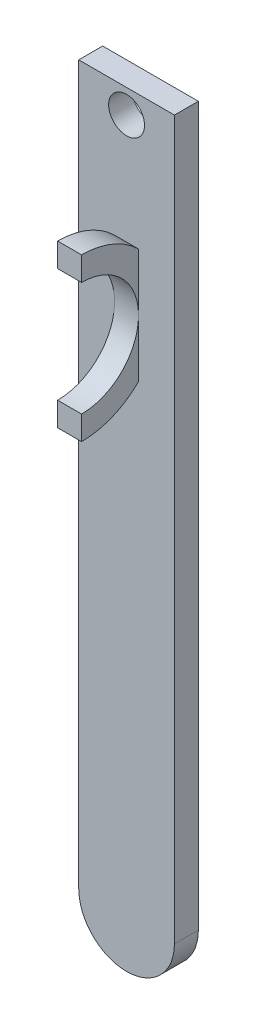
ISO-10303-21;
HEADER;
FILE_DESCRIPTION(('STEP AP214'),'2;1');
FILE_NAME('part.step','',(''),(''),'','','');
FILE_SCHEMA(('AUTOMOTIVE_DESIGN { 1 0 10303 214 1 1 1 1 }'));
ENDSEC;
DATA;
#1=APPLICATION_CONTEXT('core data for automotive mechanical design processes');
#2=APPLICATION_PROTOCOL_DEFINITION('international standard','automotive_design',2000,#1);
#3=PRODUCT_CONTEXT('',#1,'mechanical');
#4=PRODUCT('Part','Part','',(#3));
#5=PRODUCT_RELATED_PRODUCT_CATEGORY('part','',(#4));
#6=PRODUCT_DEFINITION_FORMATION('','',#4);
#7=PRODUCT_DEFINITION_CONTEXT('part definition',#1,'design');
#8=PRODUCT_DEFINITION('design','',#6,#7);
#9=PRODUCT_DEFINITION_SHAPE('','',#8);
#10=(LENGTH_UNIT() NAMED_UNIT(*) SI_UNIT(.MILLI.,.METRE.));
#11=(NAMED_UNIT(*) PLANE_ANGLE_UNIT() SI_UNIT($,.RADIAN.));
#12=(NAMED_UNIT(*) SI_UNIT($,.STERADIAN.) SOLID_ANGLE_UNIT());
#13=UNCERTAINTY_MEASURE_WITH_UNIT(LENGTH_MEASURE(1.E-05),#10,'distance_accuracy_value','');
#14=(GEOMETRIC_REPRESENTATION_CONTEXT(3) GLOBAL_UNCERTAINTY_ASSIGNED_CONTEXT((#13)) GLOBAL_UNIT_ASSIGNED_CONTEXT((#10,
#11,#12)) REPRESENTATION_CONTEXT('',''));
#15=CARTESIAN_POINT('',(0.,0.,0.));
#16=DIRECTION('',(0.,0.,1.));
#17=DIRECTION('',(1.,0.,0.));
#18=AXIS2_PLACEMENT_3D('',#15,#16,#17);
#19=CARTESIAN_POINT('',(-20.,0.,10.));
#20=DIRECTION('',(1.,0.,0.));
#21=DIRECTION('',(0.,1.,0.));
#22=AXIS2_PLACEMENT_3D('',#19,#20,#21);
#23=PLANE('',#22);
#24=DIRECTION('',(0.,-1.,0.));
#25=VECTOR('',#24,1.);
#26=CARTESIAN_POINT('',(-20.,0.,0.));
#27=LINE('',#26,#25);
#28=CARTESIAN_POINT('',(-20.,160.,0.));
#29=VERTEX_POINT('',#28);
#30=CARTESIAN_POINT('',(-20.,-140.,0.));
#31=VERTEX_POINT('',#30);
#32=EDGE_CURVE('E168',#29,#31,#27,.T.);
#33=ORIENTED_EDGE('',*,*,#32,.T.);
#34=DIRECTION('',(0.,0.,-1.));
#35=VECTOR('',#34,1.);
#36=CARTESIAN_POINT('',(-20.,-140.,10.));
#37=LINE('',#36,#35);
#38=CARTESIAN_POINT('',(-20.,-140.,10.));
#39=VERTEX_POINT('',#38);
#40=EDGE_CURVE('E11',#39,#31,#37,.T.);
#41=ORIENTED_EDGE('',*,*,#40,.F.);
#42=DIRECTION('',(0.,-1.,0.));
#43=VECTOR('',#42,1.);
#44=CARTESIAN_POINT('',(-20.,0.,10.));
#45=LINE('',#44,#43);
#46=CARTESIAN_POINT('',(-20.,160.,10.));
#47=VERTEX_POINT('',#46);
#48=EDGE_CURVE('E171',#47,#39,#45,.T.);
#49=ORIENTED_EDGE('',*,*,#48,.F.);
#50=DIRECTION('',(0.,0.,-1.));
#51=VECTOR('',#50,1.);
#52=CARTESIAN_POINT('',(-20.,160.,10.));
#53=LINE('',#52,#51);
#54=EDGE_CURVE('E58',#47,#29,#53,.T.);
#55=ORIENTED_EDGE('',*,*,#54,.T.);
#56=EDGE_LOOP('',(#33,#41,#49,#55));
#57=FACE_BOUND('',#56,.T.);
#58=ADVANCED_FACE('F35',(#57),#23,.F.);
#59=CARTESIAN_POINT('',(0.,-140.,10.));
#60=DIRECTION('',(0.,0.,-1.));
#61=DIRECTION('',(-1.,0.,0.));
#62=AXIS2_PLACEMENT_3D('',#59,#60,#61);
#63=CYLINDRICAL_SURFACE('',#62,20.);
#64=CARTESIAN_POINT('',(0.,-140.,0.));
#65=DIRECTION('',(0.,0.,1.));
#66=DIRECTION('',(1.,0.,0.));
#67=AXIS2_PLACEMENT_3D('',#64,#65,#66);
#68=CIRCLE('',#67,20.);
#69=CARTESIAN_POINT('',(20.,-140.,0.));
#70=VERTEX_POINT('',#69);
#71=EDGE_CURVE('E181',#31,#70,#68,.T.);
#72=ORIENTED_EDGE('',*,*,#71,.T.);
#73=DIRECTION('',(0.,0.,-1.));
#74=VECTOR('',#73,1.);
#75=CARTESIAN_POINT('',(20.,-140.,10.));
#76=LINE('',#75,#74);
#77=CARTESIAN_POINT('',(20.,-140.,10.));
#78=VERTEX_POINT('',#77);
#79=EDGE_CURVE('E42',#78,#70,#76,.T.);
#80=ORIENTED_EDGE('',*,*,#79,.F.);
#81=CARTESIAN_POINT('',(0.,-140.,10.));
#82=DIRECTION('',(0.,0.,1.));
#83=DIRECTION('',(1.,0.,0.));
#84=AXIS2_PLACEMENT_3D('',#81,#82,#83);
#85=CIRCLE('',#84,20.);
#86=EDGE_CURVE('E84',#39,#78,#85,.T.);
#87=ORIENTED_EDGE('',*,*,#86,.F.);
#88=ORIENTED_EDGE('',*,*,#40,.T.);
#89=EDGE_LOOP('',(#72,#80,#87,#88));
#90=FACE_BOUND('',#89,.T.);
#91=ADVANCED_FACE('F195',(#90),#63,.T.);
#92=CARTESIAN_POINT('',(20.,0.,10.));
#93=DIRECTION('',(1.,0.,0.));
#94=DIRECTION('',(0.,1.,0.));
#95=AXIS2_PLACEMENT_3D('',#92,#93,#94);
#96=PLANE('',#95);
#97=DIRECTION('',(0.,-1.,0.));
#98=VECTOR('',#97,1.);
#99=CARTESIAN_POINT('',(20.,0.,0.));
#100=LINE('',#99,#98);
#101=CARTESIAN_POINT('',(20.,160.,0.));
#102=VERTEX_POINT('',#101);
#103=EDGE_CURVE('E184',#102,#70,#100,.T.);
#104=ORIENTED_EDGE('',*,*,#103,.F.);
#105=DIRECTION('',(0.,0.,-1.));
#106=VECTOR('',#105,1.);
#107=CARTESIAN_POINT('',(20.,160.,10.));
#108=LINE('',#107,#106);
#109=CARTESIAN_POINT('',(20.,160.,10.));
#110=VERTEX_POINT('',#109);
#111=EDGE_CURVE('E190',#110,#102,#108,.T.);
#112=ORIENTED_EDGE('',*,*,#111,.F.);
#113=DIRECTION('',(0.,-1.,0.));
#114=VECTOR('',#113,1.);
#115=CARTESIAN_POINT('',(20.,0.,10.));
#116=LINE('',#115,#114);
#117=EDGE_CURVE('E175',#110,#78,#116,.T.);
#118=ORIENTED_EDGE('',*,*,#117,.T.);
#119=ORIENTED_EDGE('',*,*,#79,.T.);
#120=EDGE_LOOP('',(#104,#112,#118,#119));
#121=FACE_BOUND('',#120,.T.);
#122=ADVANCED_FACE('F193',(#121),#96,.T.);
#123=CARTESIAN_POINT('',(0.,160.,10.));
#124=DIRECTION('',(0.,1.,0.));
#125=DIRECTION('',(0.,0.,1.));
#126=AXIS2_PLACEMENT_3D('',#123,#124,#125);
#127=PLANE('',#126);
#128=DIRECTION('',(1.,0.,0.));
#129=VECTOR('',#128,1.);
#130=CARTESIAN_POINT('',(0.,160.,0.));
#131=LINE('',#130,#129);
#132=EDGE_CURVE('E173',#29,#102,#131,.T.);
#133=ORIENTED_EDGE('',*,*,#132,.F.);
#134=ORIENTED_EDGE('',*,*,#54,.F.);
#135=DIRECTION('',(1.,0.,0.));
#136=VECTOR('',#135,1.);
#137=CARTESIAN_POINT('',(0.,160.,10.));
#138=LINE('',#137,#136);
#139=EDGE_CURVE('E178',#47,#110,#138,.T.);
#140=ORIENTED_EDGE('',*,*,#139,.T.);
#141=ORIENTED_EDGE('',*,*,#111,.T.);
#142=EDGE_LOOP('',(#133,#134,#140,#141));
#143=FACE_BOUND('',#142,.T.);
#144=ADVANCED_FACE('F199',(#143),#127,.T.);
#145=CARTESIAN_POINT('',(0.,0.,10.));
#146=DIRECTION('',(0.,0.,1.));
#147=DIRECTION('',(1.,0.,0.));
#148=AXIS2_PLACEMENT_3D('',#145,#146,#147);
#149=PLANE('',#148);
#150=DIRECTION('',(0.,1.,0.));
#151=VECTOR('',#150,1.);
#152=CARTESIAN_POINT('',(5.,0.,10.));
#153=LINE('',#152,#151);
#154=CARTESIAN_POINT('',(5.,55.9963410220267,10.));
#155=VERTEX_POINT('',#154);
#156=CARTESIAN_POINT('',(5.,80.,10.));
#157=VERTEX_POINT('',#156);
#158=EDGE_CURVE('E158',#155,#157,#153,.T.);
#159=ORIENTED_EDGE('',*,*,#158,.F.);
#160=DIRECTION('',(-1.,0.,0.));
#161=VECTOR('',#160,1.);
#162=CARTESIAN_POINT('',(5.,55.9963410220267,10.));
#163=LINE('',#162,#161);
#164=CARTESIAN_POINT('',(-5.,55.9963410220267,10.));
#165=VERTEX_POINT('',#164);
#166=EDGE_CURVE('E159',#155,#165,#163,.T.);
#167=ORIENTED_EDGE('',*,*,#166,.T.);
#168=DIRECTION('',(0.,1.,0.));
#169=VECTOR('',#168,1.);
#170=CARTESIAN_POINT('',(-5.,0.,10.));
#171=LINE('',#170,#169);
#172=CARTESIAN_POINT('',(-5.,80.,10.));
#173=VERTEX_POINT('',#172);
#174=EDGE_CURVE('E151',#165,#173,#171,.T.);
#175=ORIENTED_EDGE('',*,*,#174,.T.);
#176=CARTESIAN_POINT('',(-5.,104.003658977973,10.));
#177=VERTEX_POINT('',#176);
#178=EDGE_CURVE('E148',#173,#177,#171,.T.);
#179=ORIENTED_EDGE('',*,*,#178,.T.);
#180=DIRECTION('',(-1.,0.,0.));
#181=VECTOR('',#180,1.);
#182=CARTESIAN_POINT('',(5.,104.003658977973,10.));
#183=LINE('',#182,#181);
#184=CARTESIAN_POINT('',(5.,104.003658977973,10.));
#185=VERTEX_POINT('',#184);
#186=EDGE_CURVE('E162',#177,#185,#183,.F.);
#187=ORIENTED_EDGE('',*,*,#186,.T.);
#188=EDGE_CURVE('E131',#157,#185,#153,.T.);
#189=ORIENTED_EDGE('',*,*,#188,.F.);
#190=EDGE_LOOP('',(#159,#167,#175,#179,#187,#189));
#191=FACE_BOUND('',#190,.T.);
#192=CARTESIAN_POINT('',(0.,150.,10.));
#193=DIRECTION('',(0.,0.,-1.));
#194=DIRECTION('',(-1.,0.,0.));
#195=AXIS2_PLACEMENT_3D('',#192,#193,#194);
#196=CIRCLE('',#195,7.50000000000001);
#197=CARTESIAN_POINT('',(-7.50000000000001,150.,10.));
#198=VERTEX_POINT('',#197);
#199=EDGE_CURVE('E165',#198,#198,#196,.T.);
#200=ORIENTED_EDGE('',*,*,#199,.T.);
#201=EDGE_LOOP('',(#200));
#202=FACE_BOUND('',#201,.T.);
#203=ORIENTED_EDGE('',*,*,#48,.T.);
#204=ORIENTED_EDGE('',*,*,#86,.T.);
#205=ORIENTED_EDGE('',*,*,#117,.F.);
#206=ORIENTED_EDGE('',*,*,#139,.F.);
#207=EDGE_LOOP('',(#203,#204,#205,#206));
#208=FACE_BOUND('',#207,.T.);
#209=ADVANCED_FACE('F202',(#191,#202,#208),#149,.T.);
#210=CARTESIAN_POINT('',(0.,0.,0.));
#211=DIRECTION('',(0.,0.,1.));
#212=DIRECTION('',(1.,0.,0.));
#213=AXIS2_PLACEMENT_3D('',#210,#211,#212);
#214=PLANE('',#213);
#215=CARTESIAN_POINT('',(0.,150.,0.));
#216=DIRECTION('',(0.,0.,-1.));
#217=DIRECTION('',(-1.,0.,0.));
#218=AXIS2_PLACEMENT_3D('',#215,#216,#217);
#219=CIRCLE('',#218,7.50000000000001);
#220=CARTESIAN_POINT('',(-7.50000000000001,150.,0.));
#221=VERTEX_POINT('',#220);
#222=EDGE_CURVE('E164',#221,#221,#219,.T.);
#223=ORIENTED_EDGE('',*,*,#222,.F.);
#224=EDGE_LOOP('',(#223));
#225=FACE_BOUND('',#224,.T.);
#226=ORIENTED_EDGE('',*,*,#32,.F.);
#227=ORIENTED_EDGE('',*,*,#132,.T.);
#228=ORIENTED_EDGE('',*,*,#103,.T.);
#229=ORIENTED_EDGE('',*,*,#71,.F.);
#230=EDGE_LOOP('',(#226,#227,#228,#229));
#231=FACE_BOUND('',#230,.T.);
#232=ADVANCED_FACE('F198',(#225,#231),#214,.F.);
#233=CARTESIAN_POINT('',(0.,150.,10.));
#234=DIRECTION('',(0.,0.,-1.));
#235=DIRECTION('',(-1.,0.,0.));
#236=AXIS2_PLACEMENT_3D('',#233,#234,#235);
#237=CYLINDRICAL_SURFACE('',#236,7.50000000000001);
#238=ORIENTED_EDGE('',*,*,#199,.F.);
#239=EDGE_LOOP('',(#238));
#240=FACE_BOUND('',#239,.T.);
#241=ORIENTED_EDGE('',*,*,#222,.T.);
#242=EDGE_LOOP('',(#241));
#243=FACE_BOUND('',#242,.T.);
#244=ADVANCED_FACE('F216',(#240,#243),#237,.F.);
#245=CARTESIAN_POINT('',(5.,80.,33.8087822165418));
#246=DIRECTION('',(-1.,0.,0.));
#247=DIRECTION('',(0.,0.,1.));
#248=AXIS2_PLACEMENT_3D('',#245,#246,#247);
#249=CYLINDRICAL_SURFACE('',#248,23.8087822165418);
#250=CARTESIAN_POINT('',(5.,80.,33.8087822165418));
#251=DIRECTION('',(-1.,0.,0.));
#252=DIRECTION('',(0.,0.,-1.));
#253=AXIS2_PLACEMENT_3D('',#250,#251,#252);
#254=CIRCLE('',#253,23.8087822165418);
#255=CARTESIAN_POINT('',(5.,56.1912177834582,33.8087822165418));
#256=VERTEX_POINT('',#255);
#257=EDGE_CURVE('E145',#157,#256,#254,.T.);
#258=ORIENTED_EDGE('',*,*,#257,.F.);
#259=CARTESIAN_POINT('',(5.,103.808782216542,33.8087822165418));
#260=VERTEX_POINT('',#259);
#261=EDGE_CURVE('E280',#260,#157,#254,.T.);
#262=ORIENTED_EDGE('',*,*,#261,.F.);
#263=DIRECTION('',(-1.,0.,0.));
#264=VECTOR('',#263,1.);
#265=CARTESIAN_POINT('',(5.,103.808782216542,33.8087822165418));
#266=LINE('',#265,#264);
#267=CARTESIAN_POINT('',(-5.,103.808782216542,33.8087822165418));
#268=VERTEX_POINT('',#267);
#269=EDGE_CURVE('E143',#260,#268,#266,.T.);
#270=ORIENTED_EDGE('',*,*,#269,.T.);
#271=CARTESIAN_POINT('',(-5.,80.,33.8087822165418));
#272=DIRECTION('',(-1.,0.,0.));
#273=DIRECTION('',(0.,0.,-1.));
#274=AXIS2_PLACEMENT_3D('',#271,#272,#273);
#275=CIRCLE('',#274,23.8087822165418);
#276=EDGE_CURVE('E266',#268,#173,#275,.T.);
#277=ORIENTED_EDGE('',*,*,#276,.T.);
#278=CARTESIAN_POINT('',(-5.,56.1912177834582,33.8087822165418));
#279=VERTEX_POINT('',#278);
#280=EDGE_CURVE('E268',#173,#279,#275,.T.);
#281=ORIENTED_EDGE('',*,*,#280,.T.);
#282=DIRECTION('',(-1.,0.,0.));
#283=VECTOR('',#282,1.);
#284=CARTESIAN_POINT('',(5.,56.1912177834582,33.8087822165418));
#285=LINE('',#284,#283);
#286=EDGE_CURVE('E153',#256,#279,#285,.T.);
#287=ORIENTED_EDGE('',*,*,#286,.F.);
#288=EDGE_LOOP('',(#258,#262,#270,#277,#281,#287));
#289=FACE_BOUND('',#288,.T.);
#290=ADVANCED_FACE('F223',(#289),#249,.F.);
#291=CARTESIAN_POINT('',(5.,80.,33.8087822165418));
#292=DIRECTION('',(-1.,0.,0.));
#293=DIRECTION('',(0.,0.,1.));
#294=AXIS2_PLACEMENT_3D('',#291,#292,#293);
#295=CYLINDRICAL_SURFACE('',#294,33.8087822165418);
#296=ORIENTED_EDGE('',*,*,#166,.F.);
#297=CARTESIAN_POINT('',(5.,80.,33.8087822165418));
#298=DIRECTION('',(1.,0.,0.));
#299=DIRECTION('',(0.,0.,-1.));
#300=AXIS2_PLACEMENT_3D('',#297,#298,#299);
#301=CIRCLE('',#300,33.8087822165418);
#302=CARTESIAN_POINT('',(5.,46.1912177834582,33.8087822165418));
#303=VERTEX_POINT('',#302);
#304=EDGE_CURVE('E135',#303,#155,#301,.T.);
#305=ORIENTED_EDGE('',*,*,#304,.F.);
#306=DIRECTION('',(-1.,0.,0.));
#307=VECTOR('',#306,1.);
#308=CARTESIAN_POINT('',(5.,46.1912177834582,33.8087822165418));
#309=LINE('',#308,#307);
#310=CARTESIAN_POINT('',(-5.,46.1912177834582,33.8087822165418));
#311=VERTEX_POINT('',#310);
#312=EDGE_CURVE('E279',#303,#311,#309,.T.);
#313=ORIENTED_EDGE('',*,*,#312,.T.);
#314=CARTESIAN_POINT('',(-5.,80.,33.8087822165418));
#315=DIRECTION('',(1.,0.,0.));
#316=DIRECTION('',(0.,0.,-1.));
#317=AXIS2_PLACEMENT_3D('',#314,#315,#316);
#318=CIRCLE('',#317,33.8087822165418);
#319=EDGE_CURVE('E283',#311,#165,#318,.T.);
#320=ORIENTED_EDGE('',*,*,#319,.T.);
#321=EDGE_LOOP('',(#296,#305,#313,#320));
#322=FACE_BOUND('',#321,.T.);
#323=ADVANCED_FACE('F228',(#322),#295,.T.);
#324=CARTESIAN_POINT('',(5.,80.,33.8087822165418));
#325=DIRECTION('',(1.,0.,0.));
#326=DIRECTION('',(0.,0.,-1.));
#327=AXIS2_PLACEMENT_3D('',#324,#325,#326);
#328=PLANE('',#327);
#329=ORIENTED_EDGE('',*,*,#304,.T.);
#330=ORIENTED_EDGE('',*,*,#158,.T.);
#331=ORIENTED_EDGE('',*,*,#257,.T.);
#332=DIRECTION('',(0.,-1.,0.));
#333=VECTOR('',#332,1.);
#334=CARTESIAN_POINT('',(5.,56.1912177834582,33.8087822165418));
#335=LINE('',#334,#333);
#336=EDGE_CURVE('E258',#256,#303,#335,.T.);
#337=ORIENTED_EDGE('',*,*,#336,.T.);
#338=EDGE_LOOP('',(#329,#330,#331,#337));
#339=FACE_BOUND('',#338,.T.);
#340=ADVANCED_FACE('F242',(#339),#328,.T.);
#341=CARTESIAN_POINT('',(-5.,80.,33.8087822165418));
#342=DIRECTION('',(1.,0.,0.));
#343=DIRECTION('',(0.,0.,-1.));
#344=AXIS2_PLACEMENT_3D('',#341,#342,#343);
#345=PLANE('',#344);
#346=ORIENTED_EDGE('',*,*,#174,.F.);
#347=ORIENTED_EDGE('',*,*,#319,.F.);
#348=DIRECTION('',(0.,-1.,0.));
#349=VECTOR('',#348,1.);
#350=CARTESIAN_POINT('',(-5.,56.1912177834582,33.8087822165418));
#351=LINE('',#350,#349);
#352=EDGE_CURVE('E136',#279,#311,#351,.T.);
#353=ORIENTED_EDGE('',*,*,#352,.F.);
#354=ORIENTED_EDGE('',*,*,#280,.F.);
#355=EDGE_LOOP('',(#346,#347,#353,#354));
#356=FACE_BOUND('',#355,.T.);
#357=ADVANCED_FACE('F227',(#356),#345,.F.);
#358=ORIENTED_EDGE('',*,*,#186,.F.);
#359=CARTESIAN_POINT('',(-5.,113.808782216542,33.8087822165418));
#360=VERTEX_POINT('',#359);
#361=EDGE_CURVE('E49',#177,#360,#318,.T.);
#362=ORIENTED_EDGE('',*,*,#361,.T.);
#363=DIRECTION('',(-1.,0.,0.));
#364=VECTOR('',#363,1.);
#365=CARTESIAN_POINT('',(5.,113.808782216542,33.8087822165418));
#366=LINE('',#365,#364);
#367=CARTESIAN_POINT('',(5.,113.808782216542,33.8087822165418));
#368=VERTEX_POINT('',#367);
#369=EDGE_CURVE('E141',#368,#360,#366,.T.);
#370=ORIENTED_EDGE('',*,*,#369,.F.);
#371=EDGE_CURVE('E124',#185,#368,#301,.T.);
#372=ORIENTED_EDGE('',*,*,#371,.F.);
#373=EDGE_LOOP('',(#358,#362,#370,#372));
#374=FACE_BOUND('',#373,.T.);
#375=ADVANCED_FACE('F147',(#374),#295,.T.);
#376=CARTESIAN_POINT('',(5.,113.808782216542,33.8087822165418));
#377=DIRECTION('',(0.,0.,-1.));
#378=DIRECTION('',(0.,1.,0.));
#379=AXIS2_PLACEMENT_3D('',#376,#377,#378);
#380=PLANE('',#379);
#381=DIRECTION('',(0.,-1.,0.));
#382=VECTOR('',#381,1.);
#383=CARTESIAN_POINT('',(-5.,113.808782216542,33.8087822165418));
#384=LINE('',#383,#382);
#385=EDGE_CURVE('E273',#360,#268,#384,.T.);
#386=ORIENTED_EDGE('',*,*,#385,.T.);
#387=ORIENTED_EDGE('',*,*,#269,.F.);
#388=DIRECTION('',(0.,-1.,0.));
#389=VECTOR('',#388,1.);
#390=CARTESIAN_POINT('',(5.,113.808782216542,33.8087822165418));
#391=LINE('',#390,#389);
#392=EDGE_CURVE('E128',#368,#260,#391,.T.);
#393=ORIENTED_EDGE('',*,*,#392,.F.);
#394=ORIENTED_EDGE('',*,*,#369,.T.);
#395=EDGE_LOOP('',(#386,#387,#393,#394));
#396=FACE_BOUND('',#395,.T.);
#397=ADVANCED_FACE('F140',(#396),#380,.F.);
#398=CARTESIAN_POINT('',(5.,56.1912177834582,33.8087822165418));
#399=DIRECTION('',(0.,0.,-1.));
#400=DIRECTION('',(-1.,0.,0.));
#401=AXIS2_PLACEMENT_3D('',#398,#399,#400);
#402=PLANE('',#401);
#403=ORIENTED_EDGE('',*,*,#352,.T.);
#404=ORIENTED_EDGE('',*,*,#312,.F.);
#405=ORIENTED_EDGE('',*,*,#336,.F.);
#406=ORIENTED_EDGE('',*,*,#286,.T.);
#407=EDGE_LOOP('',(#403,#404,#405,#406));
#408=FACE_BOUND('',#407,.T.);
#409=ADVANCED_FACE('F231',(#408),#402,.F.);
#410=ORIENTED_EDGE('',*,*,#261,.T.);
#411=ORIENTED_EDGE('',*,*,#188,.T.);
#412=ORIENTED_EDGE('',*,*,#371,.T.);
#413=ORIENTED_EDGE('',*,*,#392,.T.);
#414=EDGE_LOOP('',(#410,#411,#412,#413));
#415=FACE_BOUND('',#414,.T.);
#416=ADVANCED_FACE('F127',(#415),#328,.T.);
#417=ORIENTED_EDGE('',*,*,#178,.F.);
#418=ORIENTED_EDGE('',*,*,#276,.F.);
#419=ORIENTED_EDGE('',*,*,#385,.F.);
#420=ORIENTED_EDGE('',*,*,#361,.F.);
#421=EDGE_LOOP('',(#417,#418,#419,#420));
#422=FACE_BOUND('',#421,.T.);
#423=ADVANCED_FACE('F238',(#422),#345,.F.);
#424=CLOSED_SHELL('',(#58,#91,#122,#144,#209,#232,#244,#290,#323,#340,#357,#375,#397,#409,#416,#423));
#425=MANIFOLD_SOLID_BREP('B2',#424);
#426=ADVANCED_BREP_SHAPE_REPRESENTATION('',(#18,#425),#14);
#427=SHAPE_DEFINITION_REPRESENTATION(#9,#426);
ENDSEC;
END-ISO-10303-21;
